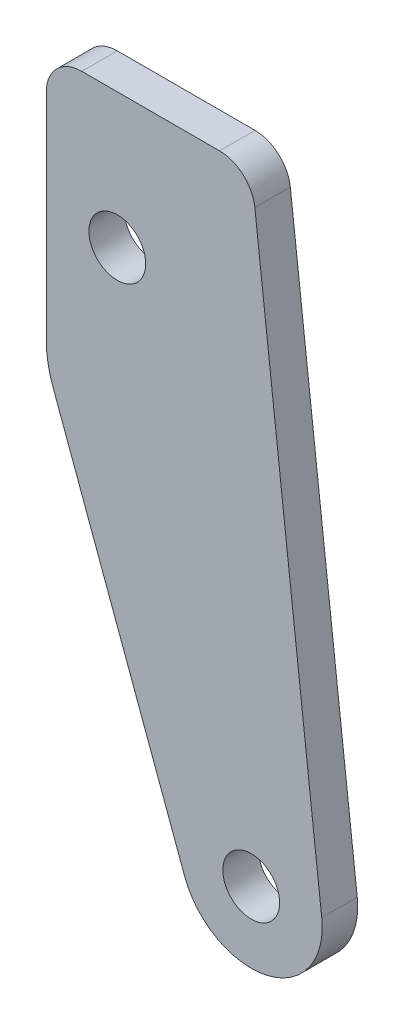
ISO-10303-21;
HEADER;
FILE_DESCRIPTION(('STEP AP214'),'2;1');
FILE_NAME('part.step','',(''),(''),'','','');
FILE_SCHEMA(('AUTOMOTIVE_DESIGN { 1 0 10303 214 1 1 1 1 }'));
ENDSEC;
DATA;
#1=APPLICATION_CONTEXT('core data for automotive mechanical design processes');
#2=APPLICATION_PROTOCOL_DEFINITION('international standard','automotive_design',2000,#1);
#3=PRODUCT_CONTEXT('',#1,'mechanical');
#4=PRODUCT('Part','Part','',(#3));
#5=PRODUCT_RELATED_PRODUCT_CATEGORY('part','',(#4));
#6=PRODUCT_DEFINITION_FORMATION('','',#4);
#7=PRODUCT_DEFINITION_CONTEXT('part definition',#1,'design');
#8=PRODUCT_DEFINITION('design','',#6,#7);
#9=PRODUCT_DEFINITION_SHAPE('','',#8);
#10=(LENGTH_UNIT() NAMED_UNIT(*) SI_UNIT(.MILLI.,.METRE.));
#11=(NAMED_UNIT(*) PLANE_ANGLE_UNIT() SI_UNIT($,.RADIAN.));
#12=(NAMED_UNIT(*) SI_UNIT($,.STERADIAN.) SOLID_ANGLE_UNIT());
#13=UNCERTAINTY_MEASURE_WITH_UNIT(LENGTH_MEASURE(1.E-05),#10,'distance_accuracy_value','');
#14=(GEOMETRIC_REPRESENTATION_CONTEXT(3) GLOBAL_UNCERTAINTY_ASSIGNED_CONTEXT((#13)) GLOBAL_UNIT_ASSIGNED_CONTEXT((#10,
#11,#12)) REPRESENTATION_CONTEXT('',''));
#15=CARTESIAN_POINT('',(0.,0.,0.));
#16=DIRECTION('',(0.,0.,1.));
#17=DIRECTION('',(1.,0.,0.));
#18=AXIS2_PLACEMENT_3D('',#15,#16,#17);
#19=CARTESIAN_POINT('',(-57.7360870468972,0.,10.));
#20=DIRECTION('',(1.,0.,0.));
#21=DIRECTION('',(0.,1.,0.));
#22=AXIS2_PLACEMENT_3D('',#19,#20,#21);
#23=PLANE('',#22);
#24=DIRECTION('',(0.,-1.,0.));
#25=VECTOR('',#24,1.);
#26=CARTESIAN_POINT('',(-57.7360870468972,0.,0.));
#27=LINE('',#26,#25);
#28=CARTESIAN_POINT('',(-57.7360870468972,165.,0.));
#29=VERTEX_POINT('',#28);
#30=CARTESIAN_POINT('',(-57.7360870468972,104.343867822615,0.));
#31=VERTEX_POINT('',#30);
#32=EDGE_CURVE('E136',#29,#31,#27,.T.);
#33=ORIENTED_EDGE('',*,*,#32,.T.);
#34=DIRECTION('',(0.,0.,-1.));
#35=VECTOR('',#34,1.);
#36=CARTESIAN_POINT('',(-57.7360870468972,104.343867822615,10.));
#37=LINE('',#36,#35);
#38=CARTESIAN_POINT('',(-57.7360870468972,104.343867822615,10.));
#39=VERTEX_POINT('',#38);
#40=EDGE_CURVE('E11',#39,#31,#37,.T.);
#41=ORIENTED_EDGE('',*,*,#40,.F.);
#42=DIRECTION('',(0.,-1.,0.));
#43=VECTOR('',#42,1.);
#44=CARTESIAN_POINT('',(-57.7360870468972,0.,10.));
#45=LINE('',#44,#43);
#46=CARTESIAN_POINT('',(-57.7360870468972,165.,10.));
#47=VERTEX_POINT('',#46);
#48=EDGE_CURVE('E159',#47,#39,#45,.T.);
#49=ORIENTED_EDGE('',*,*,#48,.F.);
#50=DIRECTION('',(0.,0.,-1.));
#51=VECTOR('',#50,1.);
#52=CARTESIAN_POINT('',(-57.7360870468972,165.,10.));
#53=LINE('',#52,#51);
#54=EDGE_CURVE('E135',#47,#29,#53,.T.);
#55=ORIENTED_EDGE('',*,*,#54,.T.);
#56=EDGE_LOOP('',(#33,#41,#49,#55));
#57=FACE_BOUND('',#56,.T.);
#58=ADVANCED_FACE('F35',(#57),#23,.F.);
#59=CARTESIAN_POINT('',(-27.7360870468972,104.343867822615,10.));
#60=DIRECTION('',(0.,0.,-1.));
#61=DIRECTION('',(-1.,0.,0.));
#62=AXIS2_PLACEMENT_3D('',#59,#60,#61);
#63=CYLINDRICAL_SURFACE('',#62,30.);
#64=CARTESIAN_POINT('',(-27.7360870468972,104.343867822615,0.));
#65=DIRECTION('',(0.,0.,1.));
#66=DIRECTION('',(1.,0.,0.));
#67=AXIS2_PLACEMENT_3D('',#64,#65,#66);
#68=CIRCLE('',#67,30.);
#69=CARTESIAN_POINT('',(-55.8908416393941,93.984823762651,0.));
#70=VERTEX_POINT('',#69);
#71=EDGE_CURVE('E139',#31,#70,#68,.T.);
#72=ORIENTED_EDGE('',*,*,#71,.T.);
#73=DIRECTION('',(0.,0.,-1.));
#74=VECTOR('',#73,1.);
#75=CARTESIAN_POINT('',(-55.8908416393941,93.984823762651,10.));
#76=LINE('',#75,#74);
#77=CARTESIAN_POINT('',(-55.8908416393941,93.984823762651,10.));
#78=VERTEX_POINT('',#77);
#79=EDGE_CURVE('E43',#78,#70,#76,.T.);
#80=ORIENTED_EDGE('',*,*,#79,.F.);
#81=CARTESIAN_POINT('',(-27.7360870468972,104.343867822615,10.));
#82=DIRECTION('',(0.,0.,1.));
#83=DIRECTION('',(1.,0.,0.));
#84=AXIS2_PLACEMENT_3D('',#81,#82,#83);
#85=CIRCLE('',#84,30.);
#86=EDGE_CURVE('E90',#39,#78,#85,.T.);
#87=ORIENTED_EDGE('',*,*,#86,.F.);
#88=ORIENTED_EDGE('',*,*,#40,.T.);
#89=EDGE_LOOP('',(#72,#80,#87,#88));
#90=FACE_BOUND('',#89,.T.);
#91=ADVANCED_FACE('F192',(#90),#63,.T.);
#92=CARTESIAN_POINT('',(-18.7698363949979,-6.90602937330929,10.));
#93=DIRECTION('',(0.938491819749897,0.345301468665465,0.));
#94=DIRECTION('',(-0.345301468665465,0.938491819749897,0.));
#95=AXIS2_PLACEMENT_3D('',#92,#93,#94);
#96=PLANE('',#95);
#97=DIRECTION('',(0.345301468665465,-0.938491819749897,0.));
#98=VECTOR('',#97,1.);
#99=CARTESIAN_POINT('',(-18.7698363949979,-6.90602937330929,0.));
#100=LINE('',#99,#98);
#101=CARTESIAN_POINT('',(-18.7698363949979,-6.90602937330929,0.));
#102=VERTEX_POINT('',#101);
#103=EDGE_CURVE('E141',#70,#102,#100,.T.);
#104=ORIENTED_EDGE('',*,*,#103,.T.);
#105=DIRECTION('',(0.,0.,-1.));
#106=VECTOR('',#105,1.);
#107=CARTESIAN_POINT('',(-18.7698363949979,-6.90602937330929,10.));
#108=LINE('',#107,#106);
#109=CARTESIAN_POINT('',(-18.7698363949979,-6.90602937330929,10.));
#110=VERTEX_POINT('',#109);
#111=EDGE_CURVE('E165',#110,#102,#108,.T.);
#112=ORIENTED_EDGE('',*,*,#111,.F.);
#113=DIRECTION('',(0.345301468665465,-0.938491819749897,0.));
#114=VECTOR('',#113,1.);
#115=CARTESIAN_POINT('',(-18.7698363949979,-6.90602937330929,10.));
#116=LINE('',#115,#114);
#117=EDGE_CURVE('E173',#78,#110,#116,.T.);
#118=ORIENTED_EDGE('',*,*,#117,.F.);
#119=ORIENTED_EDGE('',*,*,#79,.T.);
#120=EDGE_LOOP('',(#104,#112,#118,#119));
#121=FACE_BOUND('',#120,.T.);
#122=ADVANCED_FACE('F171',(#121),#96,.F.);
#123=CARTESIAN_POINT('',(0.,0.,10.));
#124=DIRECTION('',(0.,0.,-1.));
#125=DIRECTION('',(-1.,0.,0.));
#126=AXIS2_PLACEMENT_3D('',#123,#124,#125);
#127=CYLINDRICAL_SURFACE('',#126,20.);
#128=CARTESIAN_POINT('',(0.,0.,0.));
#129=DIRECTION('',(0.,0.,1.));
#130=DIRECTION('',(1.,0.,0.));
#131=AXIS2_PLACEMENT_3D('',#128,#129,#130);
#132=CIRCLE('',#131,20.);
#133=CARTESIAN_POINT('',(19.8689584579585,2.28571428571412,0.));
#134=VERTEX_POINT('',#133);
#135=EDGE_CURVE('E143',#102,#134,#132,.T.);
#136=ORIENTED_EDGE('',*,*,#135,.T.);
#137=DIRECTION('',(0.,0.,-1.));
#138=VECTOR('',#137,1.);
#139=CARTESIAN_POINT('',(19.8689584579585,2.28571428571412,10.));
#140=LINE('',#139,#138);
#141=CARTESIAN_POINT('',(19.8689584579585,2.28571428571412,10.));
#142=VERTEX_POINT('',#141);
#143=EDGE_CURVE('E163',#142,#134,#140,.T.);
#144=ORIENTED_EDGE('',*,*,#143,.F.);
#145=CARTESIAN_POINT('',(0.,0.,10.));
#146=DIRECTION('',(0.,0.,1.));
#147=DIRECTION('',(1.,0.,0.));
#148=AXIS2_PLACEMENT_3D('',#145,#146,#147);
#149=CIRCLE('',#148,20.);
#150=EDGE_CURVE('E184',#110,#142,#149,.T.);
#151=ORIENTED_EDGE('',*,*,#150,.F.);
#152=ORIENTED_EDGE('',*,*,#111,.T.);
#153=EDGE_LOOP('',(#136,#144,#151,#152));
#154=FACE_BOUND('',#153,.T.);
#155=ADVANCED_FACE('F182',(#154),#127,.T.);
#156=CARTESIAN_POINT('',(19.8689584579585,2.28571428571429,10.));
#157=DIRECTION('',(0.993447922897926,0.114285714285714,0.));
#158=DIRECTION('',(-0.114285714285714,0.993447922897926,0.));
#159=AXIS2_PLACEMENT_3D('',#156,#157,#158);
#160=PLANE('',#159);
#161=DIRECTION('',(0.114285714285714,-0.993447922897926,0.));
#162=VECTOR('',#161,1.);
#163=CARTESIAN_POINT('',(19.8689584579585,2.28571428571429,0.));
#164=LINE('',#163,#162);
#165=CARTESIAN_POINT('',(1.01892094656198,166.142857142857,0.));
#166=VERTEX_POINT('',#165);
#167=EDGE_CURVE('E146',#166,#134,#164,.T.);
#168=ORIENTED_EDGE('',*,*,#167,.F.);
#169=DIRECTION('',(0.,0.,-1.));
#170=VECTOR('',#169,1.);
#171=CARTESIAN_POINT('',(1.01892094656198,166.142857142857,10.));
#172=LINE('',#171,#170);
#173=CARTESIAN_POINT('',(1.01892094656198,166.142857142857,10.));
#174=VERTEX_POINT('',#173);
#175=EDGE_CURVE('E122',#174,#166,#172,.T.);
#176=ORIENTED_EDGE('',*,*,#175,.F.);
#177=DIRECTION('',(0.114285714285714,-0.993447922897926,0.));
#178=VECTOR('',#177,1.);
#179=CARTESIAN_POINT('',(19.8689584579585,2.28571428571429,10.));
#180=LINE('',#179,#178);
#181=EDGE_CURVE('E111',#174,#142,#180,.T.);
#182=ORIENTED_EDGE('',*,*,#181,.T.);
#183=ORIENTED_EDGE('',*,*,#143,.T.);
#184=EDGE_LOOP('',(#168,#176,#182,#183));
#185=FACE_BOUND('',#184,.T.);
#186=ADVANCED_FACE('F202',(#185),#160,.T.);
#187=CARTESIAN_POINT('',(-8.91555828241728,165.,10.));
#188=DIRECTION('',(0.,0.,-1.));
#189=DIRECTION('',(-1.,0.,0.));
#190=AXIS2_PLACEMENT_3D('',#187,#188,#189);
#191=CYLINDRICAL_SURFACE('',#190,10.);
#192=CARTESIAN_POINT('',(-8.91555828241728,165.,0.));
#193=DIRECTION('',(0.,0.,1.));
#194=DIRECTION('',(1.,0.,0.));
#195=AXIS2_PLACEMENT_3D('',#192,#193,#194);
#196=CIRCLE('',#195,10.);
#197=CARTESIAN_POINT('',(-8.91555828241735,175.,0.));
#198=VERTEX_POINT('',#197);
#199=EDGE_CURVE('E118',#166,#198,#196,.T.);
#200=ORIENTED_EDGE('',*,*,#199,.T.);
#201=DIRECTION('',(0.,0.,-1.));
#202=VECTOR('',#201,1.);
#203=CARTESIAN_POINT('',(-8.91555828241735,175.,10.));
#204=LINE('',#203,#202);
#205=CARTESIAN_POINT('',(-8.91555828241735,175.,10.));
#206=VERTEX_POINT('',#205);
#207=EDGE_CURVE('E115',#206,#198,#204,.T.);
#208=ORIENTED_EDGE('',*,*,#207,.F.);
#209=CARTESIAN_POINT('',(-8.91555828241728,165.,10.));
#210=DIRECTION('',(0.,0.,1.));
#211=DIRECTION('',(1.,0.,0.));
#212=AXIS2_PLACEMENT_3D('',#209,#210,#211);
#213=CIRCLE('',#212,10.);
#214=EDGE_CURVE('E104',#174,#206,#213,.T.);
#215=ORIENTED_EDGE('',*,*,#214,.F.);
#216=ORIENTED_EDGE('',*,*,#175,.T.);
#217=EDGE_LOOP('',(#200,#208,#215,#216));
#218=FACE_BOUND('',#217,.T.);
#219=ADVANCED_FACE('F116',(#218),#191,.T.);
#220=CARTESIAN_POINT('',(0.,175.,10.));
#221=DIRECTION('',(0.,1.,0.));
#222=DIRECTION('',(0.,0.,1.));
#223=AXIS2_PLACEMENT_3D('',#220,#221,#222);
#224=PLANE('',#223);
#225=DIRECTION('',(1.,0.,0.));
#226=VECTOR('',#225,1.);
#227=CARTESIAN_POINT('',(0.,175.,0.));
#228=LINE('',#227,#226);
#229=CARTESIAN_POINT('',(-47.7360870468971,175.,0.));
#230=VERTEX_POINT('',#229);
#231=EDGE_CURVE('E150',#230,#198,#228,.T.);
#232=ORIENTED_EDGE('',*,*,#231,.F.);
#233=DIRECTION('',(0.,0.,-1.));
#234=VECTOR('',#233,1.);
#235=CARTESIAN_POINT('',(-47.7360870468971,175.,10.));
#236=LINE('',#235,#234);
#237=CARTESIAN_POINT('',(-47.7360870468971,175.,10.));
#238=VERTEX_POINT('',#237);
#239=EDGE_CURVE('E79',#238,#230,#236,.T.);
#240=ORIENTED_EDGE('',*,*,#239,.F.);
#241=DIRECTION('',(1.,0.,0.));
#242=VECTOR('',#241,1.);
#243=CARTESIAN_POINT('',(0.,175.,10.));
#244=LINE('',#243,#242);
#245=EDGE_CURVE('E109',#238,#206,#244,.T.);
#246=ORIENTED_EDGE('',*,*,#245,.T.);
#247=ORIENTED_EDGE('',*,*,#207,.T.);
#248=EDGE_LOOP('',(#232,#240,#246,#247));
#249=FACE_BOUND('',#248,.T.);
#250=ADVANCED_FACE('F124',(#249),#224,.T.);
#251=CARTESIAN_POINT('',(-37.7360870468972,137.,10.));
#252=DIRECTION('',(0.,0.,-1.));
#253=DIRECTION('',(-1.,0.,0.));
#254=AXIS2_PLACEMENT_3D('',#251,#252,#253);
#255=CYLINDRICAL_SURFACE('',#254,8.);
#256=CARTESIAN_POINT('',(-37.7360870468972,137.,10.));
#257=DIRECTION('',(0.,0.,1.));
#258=DIRECTION('',(1.,0.,0.));
#259=AXIS2_PLACEMENT_3D('',#256,#257,#258);
#260=CIRCLE('',#259,8.);
#261=CARTESIAN_POINT('',(-29.7360870468972,137.,10.));
#262=VERTEX_POINT('',#261);
#263=EDGE_CURVE('E126',#262,#262,#260,.T.);
#264=ORIENTED_EDGE('',*,*,#263,.T.);
#265=EDGE_LOOP('',(#264));
#266=FACE_BOUND('',#265,.T.);
#267=CARTESIAN_POINT('',(-37.7360870468972,137.,0.));
#268=DIRECTION('',(0.,0.,1.));
#269=DIRECTION('',(1.,0.,0.));
#270=AXIS2_PLACEMENT_3D('',#267,#268,#269);
#271=CIRCLE('',#270,8.);
#272=CARTESIAN_POINT('',(-29.7360870468972,137.,0.));
#273=VERTEX_POINT('',#272);
#274=EDGE_CURVE('E153',#273,#273,#271,.T.);
#275=ORIENTED_EDGE('',*,*,#274,.F.);
#276=EDGE_LOOP('',(#275));
#277=FACE_BOUND('',#276,.T.);
#278=ADVANCED_FACE('F210',(#266,#277),#255,.F.);
#279=CARTESIAN_POINT('',(-47.7360870468972,165.,10.));
#280=DIRECTION('',(0.,0.,-1.));
#281=DIRECTION('',(-1.,0.,0.));
#282=AXIS2_PLACEMENT_3D('',#279,#280,#281);
#283=CYLINDRICAL_SURFACE('',#282,10.);
#284=CARTESIAN_POINT('',(-47.7360870468972,165.,0.));
#285=DIRECTION('',(0.,0.,1.));
#286=DIRECTION('',(1.,0.,0.));
#287=AXIS2_PLACEMENT_3D('',#284,#285,#286);
#288=CIRCLE('',#287,10.);
#289=EDGE_CURVE('E82',#230,#29,#288,.T.);
#290=ORIENTED_EDGE('',*,*,#289,.T.);
#291=ORIENTED_EDGE('',*,*,#54,.F.);
#292=CARTESIAN_POINT('',(-47.7360870468972,165.,10.));
#293=DIRECTION('',(0.,0.,1.));
#294=DIRECTION('',(1.,0.,0.));
#295=AXIS2_PLACEMENT_3D('',#292,#293,#294);
#296=CIRCLE('',#295,10.);
#297=EDGE_CURVE('E51',#238,#47,#296,.T.);
#298=ORIENTED_EDGE('',*,*,#297,.F.);
#299=ORIENTED_EDGE('',*,*,#239,.T.);
#300=EDGE_LOOP('',(#290,#291,#298,#299));
#301=FACE_BOUND('',#300,.T.);
#302=ADVANCED_FACE('F211',(#301),#283,.T.);
#303=CARTESIAN_POINT('',(0.,0.,10.));
#304=DIRECTION('',(0.,0.,-1.));
#305=DIRECTION('',(-1.,0.,0.));
#306=AXIS2_PLACEMENT_3D('',#303,#304,#305);
#307=CYLINDRICAL_SURFACE('',#306,8.);
#308=CARTESIAN_POINT('',(0.,0.,10.));
#309=DIRECTION('',(0.,0.,1.));
#310=DIRECTION('',(1.,0.,0.));
#311=AXIS2_PLACEMENT_3D('',#308,#309,#310);
#312=CIRCLE('',#311,8.);
#313=CARTESIAN_POINT('',(8.,0.,10.));
#314=VERTEX_POINT('',#313);
#315=EDGE_CURVE('E132',#314,#314,#312,.T.);
#316=ORIENTED_EDGE('',*,*,#315,.T.);
#317=EDGE_LOOP('',(#316));
#318=FACE_BOUND('',#317,.T.);
#319=CARTESIAN_POINT('',(0.,0.,0.));
#320=DIRECTION('',(0.,0.,1.));
#321=DIRECTION('',(1.,0.,0.));
#322=AXIS2_PLACEMENT_3D('',#319,#320,#321);
#323=CIRCLE('',#322,8.);
#324=CARTESIAN_POINT('',(8.,0.,0.));
#325=VERTEX_POINT('',#324);
#326=EDGE_CURVE('E156',#325,#325,#323,.T.);
#327=ORIENTED_EDGE('',*,*,#326,.F.);
#328=EDGE_LOOP('',(#327));
#329=FACE_BOUND('',#328,.T.);
#330=ADVANCED_FACE('F214',(#318,#329),#307,.F.);
#331=CARTESIAN_POINT('',(0.,0.,10.));
#332=DIRECTION('',(0.,0.,1.));
#333=DIRECTION('',(1.,0.,0.));
#334=AXIS2_PLACEMENT_3D('',#331,#332,#333);
#335=PLANE('',#334);
#336=ORIENTED_EDGE('',*,*,#48,.T.);
#337=ORIENTED_EDGE('',*,*,#86,.T.);
#338=ORIENTED_EDGE('',*,*,#117,.T.);
#339=ORIENTED_EDGE('',*,*,#150,.T.);
#340=ORIENTED_EDGE('',*,*,#181,.F.);
#341=ORIENTED_EDGE('',*,*,#214,.T.);
#342=ORIENTED_EDGE('',*,*,#245,.F.);
#343=ORIENTED_EDGE('',*,*,#297,.T.);
#344=EDGE_LOOP('',(#336,#337,#338,#339,#340,#341,#342,#343));
#345=FACE_BOUND('',#344,.T.);
#346=ORIENTED_EDGE('',*,*,#263,.F.);
#347=EDGE_LOOP('',(#346));
#348=FACE_BOUND('',#347,.T.);
#349=ORIENTED_EDGE('',*,*,#315,.F.);
#350=EDGE_LOOP('',(#349));
#351=FACE_BOUND('',#350,.T.);
#352=ADVANCED_FACE('F106',(#345,#348,#351),#335,.T.);
#353=CARTESIAN_POINT('',(0.,0.,0.));
#354=DIRECTION('',(0.,0.,1.));
#355=DIRECTION('',(1.,0.,0.));
#356=AXIS2_PLACEMENT_3D('',#353,#354,#355);
#357=PLANE('',#356);
#358=ORIENTED_EDGE('',*,*,#32,.F.);
#359=ORIENTED_EDGE('',*,*,#289,.F.);
#360=ORIENTED_EDGE('',*,*,#231,.T.);
#361=ORIENTED_EDGE('',*,*,#199,.F.);
#362=ORIENTED_EDGE('',*,*,#167,.T.);
#363=ORIENTED_EDGE('',*,*,#135,.F.);
#364=ORIENTED_EDGE('',*,*,#103,.F.);
#365=ORIENTED_EDGE('',*,*,#71,.F.);
#366=EDGE_LOOP('',(#358,#359,#360,#361,#362,#363,#364,#365));
#367=FACE_BOUND('',#366,.T.);
#368=ORIENTED_EDGE('',*,*,#274,.T.);
#369=EDGE_LOOP('',(#368));
#370=FACE_BOUND('',#369,.T.);
#371=ORIENTED_EDGE('',*,*,#326,.T.);
#372=EDGE_LOOP('',(#371));
#373=FACE_BOUND('',#372,.T.);
#374=ADVANCED_FACE('F177',(#367,#370,#373),#357,.F.);
#375=CLOSED_SHELL('',(#58,#91,#122,#155,#186,#219,#250,#278,#302,#330,#352,#374));
#376=MANIFOLD_SOLID_BREP('B2',#375);
#377=ADVANCED_BREP_SHAPE_REPRESENTATION('',(#18,#376),#14);
#378=SHAPE_DEFINITION_REPRESENTATION(#9,#377);
ENDSEC;
END-ISO-10303-21;
